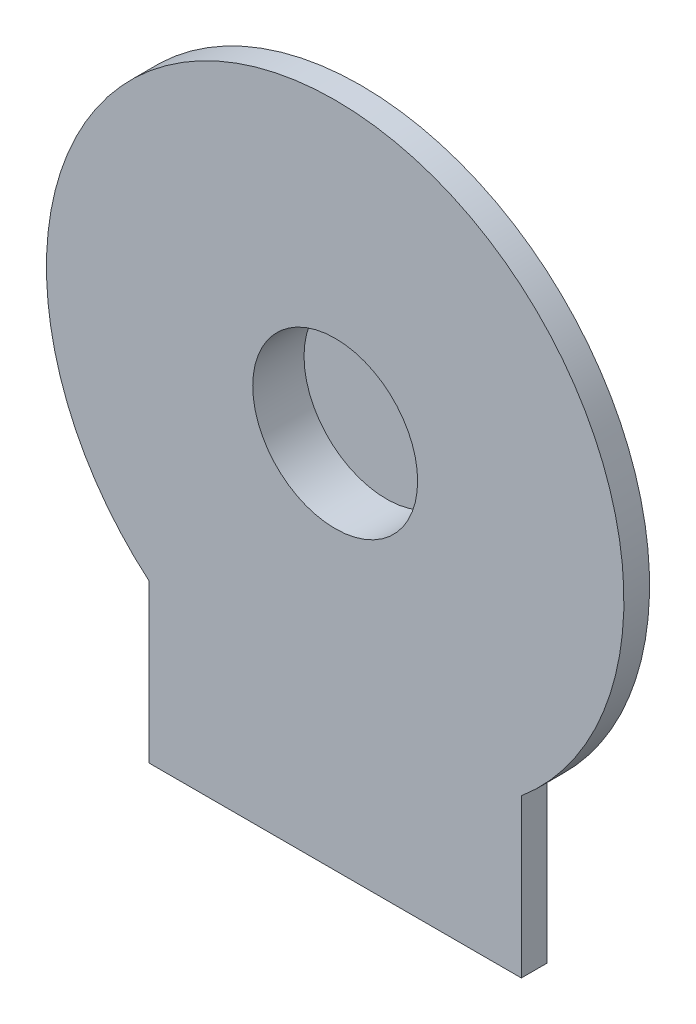
ISO-10303-21;
HEADER;
FILE_DESCRIPTION(('STEP AP214'),'2;1');
FILE_NAME('part.step','',(''),(''),'','','');
FILE_SCHEMA(('AUTOMOTIVE_DESIGN { 1 0 10303 214 1 1 1 1 }'));
ENDSEC;
DATA;
#1=APPLICATION_CONTEXT('core data for automotive mechanical design processes');
#2=APPLICATION_PROTOCOL_DEFINITION('international standard','automotive_design',2000,#1);
#3=PRODUCT_CONTEXT('',#1,'mechanical');
#4=PRODUCT('Part','Part','',(#3));
#5=PRODUCT_RELATED_PRODUCT_CATEGORY('part','',(#4));
#6=PRODUCT_DEFINITION_FORMATION('','',#4);
#7=PRODUCT_DEFINITION_CONTEXT('part definition',#1,'design');
#8=PRODUCT_DEFINITION('design','',#6,#7);
#9=PRODUCT_DEFINITION_SHAPE('','',#8);
#10=(LENGTH_UNIT() NAMED_UNIT(*) SI_UNIT(.MILLI.,.METRE.));
#11=(NAMED_UNIT(*) PLANE_ANGLE_UNIT() SI_UNIT($,.RADIAN.));
#12=(NAMED_UNIT(*) SI_UNIT($,.STERADIAN.) SOLID_ANGLE_UNIT());
#13=UNCERTAINTY_MEASURE_WITH_UNIT(LENGTH_MEASURE(1.E-05),#10,'distance_accuracy_value','');
#14=(GEOMETRIC_REPRESENTATION_CONTEXT(3) GLOBAL_UNCERTAINTY_ASSIGNED_CONTEXT((#13)) GLOBAL_UNIT_ASSIGNED_CONTEXT((#10,
#11,#12)) REPRESENTATION_CONTEXT('',''));
#15=CARTESIAN_POINT('',(0.,0.,0.));
#16=DIRECTION('',(0.,0.,1.));
#17=DIRECTION('',(1.,0.,0.));
#18=AXIS2_PLACEMENT_3D('',#15,#16,#17);
#19=CARTESIAN_POINT('',(0.,0.,0.));
#20=DIRECTION('',(0.,0.,1.));
#21=DIRECTION('',(1.,0.,0.));
#22=AXIS2_PLACEMENT_3D('',#19,#20,#21);
#23=PLANE('',#22);
#24=CARTESIAN_POINT('',(0.,0.,0.));
#25=DIRECTION('',(0.,0.,1.));
#26=DIRECTION('',(1.,0.,0.));
#27=AXIS2_PLACEMENT_3D('',#24,#25,#26);
#28=CIRCLE('',#27,28.075);
#29=CARTESIAN_POINT('',(28.075,0.,0.));
#30=VERTEX_POINT('',#29);
#31=EDGE_CURVE('E114',#30,#30,#28,.T.);
#32=ORIENTED_EDGE('',*,*,#31,.T.);
#33=EDGE_LOOP('',(#32));
#34=FACE_BOUND('',#33,.T.);
#35=DIRECTION('',(-1.,0.,0.));
#36=VECTOR('',#35,1.);
#37=CARTESIAN_POINT('',(0.,-73.8,0.));
#38=LINE('',#37,#36);
#39=CARTESIAN_POINT('',(36.3,-73.8,0.));
#40=VERTEX_POINT('',#39);
#41=CARTESIAN_POINT('',(-36.3,-73.8,0.));
#42=VERTEX_POINT('',#41);
#43=EDGE_CURVE('E104',#40,#42,#38,.T.);
#44=ORIENTED_EDGE('',*,*,#43,.T.);
#45=DIRECTION('',(0.,-1.,0.));
#46=VECTOR('',#45,1.);
#47=CARTESIAN_POINT('',(-36.3,0.,0.));
#48=LINE('',#47,#46);
#49=CARTESIAN_POINT('',(-36.3,-43.0348695827,0.));
#50=VERTEX_POINT('',#49);
#51=EDGE_CURVE('E99',#50,#42,#48,.T.);
#52=ORIENTED_EDGE('',*,*,#51,.F.);
#53=CARTESIAN_POINT('',(0.,0.,0.));
#54=DIRECTION('',(0.,0.,1.));
#55=DIRECTION('',(1.,0.,0.));
#56=AXIS2_PLACEMENT_3D('',#53,#54,#55);
#57=CIRCLE('',#56,56.3);
#58=CARTESIAN_POINT('',(36.3,-43.0348695827,0.));
#59=VERTEX_POINT('',#58);
#60=EDGE_CURVE('E68',#59,#50,#57,.T.);
#61=ORIENTED_EDGE('',*,*,#60,.F.);
#62=DIRECTION('',(0.,-1.,0.));
#63=VECTOR('',#62,1.);
#64=CARTESIAN_POINT('',(36.3,0.,0.));
#65=LINE('',#64,#63);
#66=EDGE_CURVE('E90',#59,#40,#65,.T.);
#67=ORIENTED_EDGE('',*,*,#66,.T.);
#68=EDGE_LOOP('',(#44,#52,#61,#67));
#69=FACE_BOUND('',#68,.T.);
#70=ADVANCED_FACE('F35',(#34,#69),#23,.F.);
#71=CARTESIAN_POINT('',(0.,-73.8,5.));
#72=DIRECTION('',(0.,-1.,0.));
#73=DIRECTION('',(0.,0.,-1.));
#74=AXIS2_PLACEMENT_3D('',#71,#72,#73);
#75=PLANE('',#74);
#76=ORIENTED_EDGE('',*,*,#43,.F.);
#77=DIRECTION('',(0.,0.,-1.));
#78=VECTOR('',#77,1.);
#79=CARTESIAN_POINT('',(36.3,-73.8,5.));
#80=LINE('',#79,#78);
#81=CARTESIAN_POINT('',(36.3,-73.8,5.));
#82=VERTEX_POINT('',#81);
#83=EDGE_CURVE('E79',#82,#40,#80,.T.);
#84=ORIENTED_EDGE('',*,*,#83,.F.);
#85=DIRECTION('',(-1.,0.,0.));
#86=VECTOR('',#85,1.);
#87=CARTESIAN_POINT('',(0.,-73.8,5.));
#88=LINE('',#87,#86);
#89=CARTESIAN_POINT('',(-36.3,-73.8,5.));
#90=VERTEX_POINT('',#89);
#91=EDGE_CURVE('E97',#82,#90,#88,.T.);
#92=ORIENTED_EDGE('',*,*,#91,.T.);
#93=DIRECTION('',(0.,0.,-1.));
#94=VECTOR('',#93,1.);
#95=CARTESIAN_POINT('',(-36.3,-73.8,5.));
#96=LINE('',#95,#94);
#97=EDGE_CURVE('E75',#90,#42,#96,.T.);
#98=ORIENTED_EDGE('',*,*,#97,.T.);
#99=EDGE_LOOP('',(#76,#84,#92,#98));
#100=FACE_BOUND('',#99,.T.);
#101=ADVANCED_FACE('F130',(#100),#75,.T.);
#102=CARTESIAN_POINT('',(36.3,0.,5.));
#103=DIRECTION('',(1.,0.,0.));
#104=DIRECTION('',(0.,1.,0.));
#105=AXIS2_PLACEMENT_3D('',#102,#103,#104);
#106=PLANE('',#105);
#107=ORIENTED_EDGE('',*,*,#66,.F.);
#108=DIRECTION('',(0.,0.,-1.));
#109=VECTOR('',#108,1.);
#110=CARTESIAN_POINT('',(36.3,-43.0348695827,5.));
#111=LINE('',#110,#109);
#112=CARTESIAN_POINT('',(36.3,-43.0348695827,5.));
#113=VERTEX_POINT('',#112);
#114=EDGE_CURVE('E84',#113,#59,#111,.T.);
#115=ORIENTED_EDGE('',*,*,#114,.F.);
#116=DIRECTION('',(0.,-1.,0.));
#117=VECTOR('',#116,1.);
#118=CARTESIAN_POINT('',(36.3,0.,5.));
#119=LINE('',#118,#117);
#120=EDGE_CURVE('E88',#113,#82,#119,.T.);
#121=ORIENTED_EDGE('',*,*,#120,.T.);
#122=ORIENTED_EDGE('',*,*,#83,.T.);
#123=EDGE_LOOP('',(#107,#115,#121,#122));
#124=FACE_BOUND('',#123,.T.);
#125=ADVANCED_FACE('F86',(#124),#106,.T.);
#126=CARTESIAN_POINT('',(0.,0.,5.));
#127=DIRECTION('',(0.,0.,-1.));
#128=DIRECTION('',(-1.,0.,0.));
#129=AXIS2_PLACEMENT_3D('',#126,#127,#128);
#130=CYLINDRICAL_SURFACE('',#129,56.3);
#131=ORIENTED_EDGE('',*,*,#60,.T.);
#132=DIRECTION('',(0.,0.,-1.));
#133=VECTOR('',#132,1.);
#134=CARTESIAN_POINT('',(-36.3,-43.0348695827,5.));
#135=LINE('',#134,#133);
#136=CARTESIAN_POINT('',(-36.3,-43.0348695827,5.));
#137=VERTEX_POINT('',#136);
#138=EDGE_CURVE('E91',#137,#50,#135,.T.);
#139=ORIENTED_EDGE('',*,*,#138,.F.);
#140=CARTESIAN_POINT('',(0.,0.,5.));
#141=DIRECTION('',(0.,0.,1.));
#142=DIRECTION('',(1.,0.,0.));
#143=AXIS2_PLACEMENT_3D('',#140,#141,#142);
#144=CIRCLE('',#143,56.3);
#145=EDGE_CURVE('E93',#113,#137,#144,.T.);
#146=ORIENTED_EDGE('',*,*,#145,.F.);
#147=ORIENTED_EDGE('',*,*,#114,.T.);
#148=EDGE_LOOP('',(#131,#139,#146,#147));
#149=FACE_BOUND('',#148,.T.);
#150=ADVANCED_FACE('F94',(#149),#130,.T.);
#151=CARTESIAN_POINT('',(-36.3,0.,5.));
#152=DIRECTION('',(1.,0.,0.));
#153=DIRECTION('',(0.,0.,-1.));
#154=AXIS2_PLACEMENT_3D('',#151,#152,#153);
#155=PLANE('',#154);
#156=ORIENTED_EDGE('',*,*,#51,.T.);
#157=ORIENTED_EDGE('',*,*,#97,.F.);
#158=DIRECTION('',(0.,-1.,0.));
#159=VECTOR('',#158,1.);
#160=CARTESIAN_POINT('',(-36.3,0.,5.));
#161=LINE('',#160,#159);
#162=EDGE_CURVE('E52',#137,#90,#161,.T.);
#163=ORIENTED_EDGE('',*,*,#162,.F.);
#164=ORIENTED_EDGE('',*,*,#138,.T.);
#165=EDGE_LOOP('',(#156,#157,#163,#164));
#166=FACE_BOUND('',#165,.T.);
#167=ADVANCED_FACE('F143',(#166),#155,.F.);
#168=CARTESIAN_POINT('',(0.,0.,5.));
#169=DIRECTION('',(0.,0.,1.));
#170=DIRECTION('',(1.,0.,0.));
#171=AXIS2_PLACEMENT_3D('',#168,#169,#170);
#172=PLANE('',#171);
#173=CARTESIAN_POINT('',(0.,0.,5.));
#174=DIRECTION('',(0.,0.,1.));
#175=DIRECTION('',(1.,0.,0.));
#176=AXIS2_PLACEMENT_3D('',#173,#174,#175);
#177=CIRCLE('',#176,16.075);
#178=CARTESIAN_POINT('',(16.075,0.,5.));
#179=VERTEX_POINT('',#178);
#180=EDGE_CURVE('E107',#179,#179,#177,.T.);
#181=ORIENTED_EDGE('',*,*,#180,.F.);
#182=EDGE_LOOP('',(#181));
#183=FACE_BOUND('',#182,.T.);
#184=ORIENTED_EDGE('',*,*,#91,.F.);
#185=ORIENTED_EDGE('',*,*,#120,.F.);
#186=ORIENTED_EDGE('',*,*,#145,.T.);
#187=ORIENTED_EDGE('',*,*,#162,.T.);
#188=EDGE_LOOP('',(#184,#185,#186,#187));
#189=FACE_BOUND('',#188,.T.);
#190=ADVANCED_FACE('F96',(#183,#189),#172,.T.);
#191=CARTESIAN_POINT('',(0.,0.,33.));
#192=DIRECTION('',(0.,0.,-1.));
#193=DIRECTION('',(-1.,0.,0.));
#194=AXIS2_PLACEMENT_3D('',#191,#192,#193);
#195=CYLINDRICAL_SURFACE('',#194,16.075);
#196=ORIENTED_EDGE('',*,*,#180,.T.);
#197=EDGE_LOOP('',(#196));
#198=FACE_BOUND('',#197,.T.);
#199=CARTESIAN_POINT('',(0.,0.,-5.));
#200=DIRECTION('',(0.,0.,-1.));
#201=DIRECTION('',(-1.,0.,0.));
#202=AXIS2_PLACEMENT_3D('',#199,#200,#201);
#203=CIRCLE('',#202,16.075);
#204=CARTESIAN_POINT('',(-16.075,0.,-5.));
#205=VERTEX_POINT('',#204);
#206=EDGE_CURVE('E250',#205,#205,#203,.T.);
#207=ORIENTED_EDGE('',*,*,#206,.T.);
#208=EDGE_LOOP('',(#207));
#209=FACE_BOUND('',#208,.T.);
#210=ADVANCED_FACE('F168',(#198,#209),#195,.F.);
#211=CARTESIAN_POINT('',(0.,0.,-5.));
#212=DIRECTION('',(0.,0.,-1.));
#213=DIRECTION('',(-1.,0.,0.));
#214=AXIS2_PLACEMENT_3D('',#211,#212,#213);
#215=PLANE('',#214);
#216=ORIENTED_EDGE('',*,*,#206,.F.);
#217=EDGE_LOOP('',(#216));
#218=FACE_BOUND('',#217,.T.);
#219=ADVANCED_FACE('F175',(#218),#215,.F.);
#220=CARTESIAN_POINT('',(0.,0.,-8.));
#221=DIRECTION('',(0.,0.,-1.));
#222=DIRECTION('',(-1.,0.,0.));
#223=AXIS2_PLACEMENT_3D('',#220,#221,#222);
#224=PLANE('',#223);
#225=CARTESIAN_POINT('',(0.,0.,-8.));
#226=DIRECTION('',(0.,0.,-1.));
#227=DIRECTION('',(-1.,0.,0.));
#228=AXIS2_PLACEMENT_3D('',#225,#226,#227);
#229=CIRCLE('',#228,15.4258893593265);
#230=CARTESIAN_POINT('',(-15.4258893593265,0.,-8.));
#231=VERTEX_POINT('',#230);
#232=EDGE_CURVE('E44',#231,#231,#229,.T.);
#233=ORIENTED_EDGE('',*,*,#232,.T.);
#234=EDGE_LOOP('',(#233));
#235=FACE_BOUND('',#234,.T.);
#236=ADVANCED_FACE('F119',(#235),#224,.T.);
#237=CARTESIAN_POINT('',(0.,0.,-7.));
#238=DIRECTION('',(0.,0.,1.));
#239=DIRECTION('',(1.,0.,0.));
#240=AXIS2_PLACEMENT_3D('',#237,#238,#239);
#241=TOROIDAL_SURFACE('',#240,28.075,7.);
#242=CARTESIAN_POINT('',(0.,0.,-4.));
#243=DIRECTION('',(0.,0.,-1.));
#244=DIRECTION('',(-1.,0.,0.));
#245=AXIS2_PLACEMENT_3D('',#242,#243,#244);
#246=CIRCLE('',#245,21.7504446796632);
#247=CARTESIAN_POINT('',(-21.7504446796632,0.,-4.));
#248=VERTEX_POINT('',#247);
#249=EDGE_CURVE('E11',#248,#248,#246,.F.);
#250=ORIENTED_EDGE('',*,*,#249,.T.);
#251=EDGE_LOOP('',(#250));
#252=FACE_BOUND('',#251,.T.);
#253=ORIENTED_EDGE('',*,*,#31,.F.);
#254=EDGE_LOOP('',(#253));
#255=FACE_BOUND('',#254,.T.);
#256=ADVANCED_FACE('F122',(#252,#255),#241,.F.);
#257=CARTESIAN_POINT('',(0.,0.,-1.));
#258=DIRECTION('',(0.,0.,1.));
#259=DIRECTION('',(1.,0.,0.));
#260=AXIS2_PLACEMENT_3D('',#257,#258,#259);
#261=TOROIDAL_SURFACE('',#260,15.4258893593265,7.);
#262=ORIENTED_EDGE('',*,*,#249,.F.);
#263=EDGE_LOOP('',(#262));
#264=FACE_BOUND('',#263,.T.);
#265=ORIENTED_EDGE('',*,*,#232,.F.);
#266=EDGE_LOOP('',(#265));
#267=FACE_BOUND('',#266,.T.);
#268=ADVANCED_FACE('F37',(#264,#267),#261,.T.);
#269=CLOSED_SHELL('',(#70,#101,#125,#150,#167,#190,#210,#219,#236,#256,#268));
#270=MANIFOLD_SOLID_BREP('B2',#269);
#271=ADVANCED_BREP_SHAPE_REPRESENTATION('',(#18,#270),#14);
#272=SHAPE_DEFINITION_REPRESENTATION(#9,#271);
ENDSEC;
END-ISO-10303-21;
